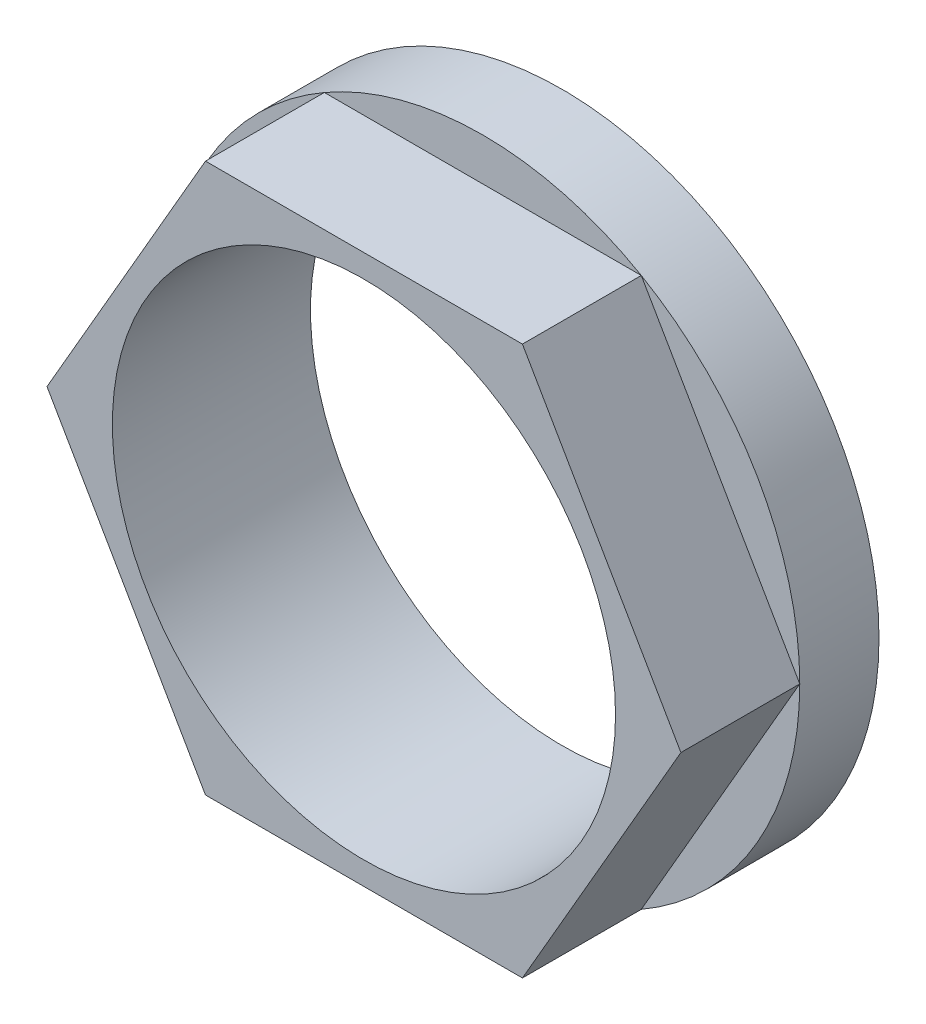
ISO-10303-21;
HEADER;
FILE_DESCRIPTION(('STEP AP214'),'2;1');
FILE_NAME('part.step','',(''),(''),'','','');
FILE_SCHEMA(('AUTOMOTIVE_DESIGN { 1 0 10303 214 1 1 1 1 }'));
ENDSEC;
DATA;
#1=APPLICATION_CONTEXT('core data for automotive mechanical design processes');
#2=APPLICATION_PROTOCOL_DEFINITION('international standard','automotive_design',2000,#1);
#3=PRODUCT_CONTEXT('',#1,'mechanical');
#4=PRODUCT('Part','Part','',(#3));
#5=PRODUCT_RELATED_PRODUCT_CATEGORY('part','',(#4));
#6=PRODUCT_DEFINITION_FORMATION('','',#4);
#7=PRODUCT_DEFINITION_CONTEXT('part definition',#1,'design');
#8=PRODUCT_DEFINITION('design','',#6,#7);
#9=PRODUCT_DEFINITION_SHAPE('','',#8);
#10=(LENGTH_UNIT() NAMED_UNIT(*) SI_UNIT(.MILLI.,.METRE.));
#11=(NAMED_UNIT(*) PLANE_ANGLE_UNIT() SI_UNIT($,.RADIAN.));
#12=(NAMED_UNIT(*) SI_UNIT($,.STERADIAN.) SOLID_ANGLE_UNIT());
#13=UNCERTAINTY_MEASURE_WITH_UNIT(LENGTH_MEASURE(1.E-05),#10,'distance_accuracy_value','');
#14=(GEOMETRIC_REPRESENTATION_CONTEXT(3) GLOBAL_UNCERTAINTY_ASSIGNED_CONTEXT((#13)) GLOBAL_UNIT_ASSIGNED_CONTEXT((#10,
#11,#12)) REPRESENTATION_CONTEXT('',''));
#15=CARTESIAN_POINT('',(0.,0.,0.));
#16=DIRECTION('',(0.,0.,1.));
#17=DIRECTION('',(1.,0.,0.));
#18=AXIS2_PLACEMENT_3D('',#15,#16,#17);
#19=CARTESIAN_POINT('',(0.,0.,2.));
#20=DIRECTION('',(0.,0.,1.));
#21=DIRECTION('',(1.,0.,0.));
#22=AXIS2_PLACEMENT_3D('',#19,#20,#21);
#23=PLANE('',#22);
#24=DIRECTION('',(0.499999999999995,0.866025403784442,0.));
#25=VECTOR('',#24,1.);
#26=CARTESIAN_POINT('',(4.00000000000008,-6.92820323027546,2.));
#27=LINE('',#26,#25);
#28=CARTESIAN_POINT('',(4.00000000000008,-6.92820323027546,2.));
#29=VERTEX_POINT('',#28);
#30=CARTESIAN_POINT('',(8.,0.,2.));
#31=VERTEX_POINT('',#30);
#32=EDGE_CURVE('E58',#29,#31,#27,.T.);
#33=ORIENTED_EDGE('',*,*,#32,.F.);
#34=CARTESIAN_POINT('',(0.,0.,2.));
#35=DIRECTION('',(0.,0.,1.));
#36=DIRECTION('',(1.,0.,0.));
#37=AXIS2_PLACEMENT_3D('',#34,#35,#36);
#38=CIRCLE('',#37,8.);
#39=EDGE_CURVE('E52',#29,#31,#38,.T.);
#40=ORIENTED_EDGE('',*,*,#39,.T.);
#41=EDGE_LOOP('',(#33,#40));
#42=FACE_BOUND('',#41,.T.);
#43=ADVANCED_FACE('F41',(#42),#23,.T.);
#44=DIRECTION('',(1.,0.,0.));
#45=VECTOR('',#44,1.);
#46=CARTESIAN_POINT('',(-3.99999999999994,-6.92820323027555,2.));
#47=LINE('',#46,#45);
#48=CARTESIAN_POINT('',(-3.99999999999994,-6.92820323027555,2.));
#49=VERTEX_POINT('',#48);
#50=EDGE_CURVE('E65',#49,#29,#47,.T.);
#51=ORIENTED_EDGE('',*,*,#50,.F.);
#52=EDGE_CURVE('E215',#49,#29,#38,.T.);
#53=ORIENTED_EDGE('',*,*,#52,.T.);
#54=EDGE_LOOP('',(#51,#53));
#55=FACE_BOUND('',#54,.T.);
#56=ADVANCED_FACE('F193',(#55),#23,.T.);
#57=DIRECTION('',(0.500000000000007,-0.866025403784435,0.));
#58=VECTOR('',#57,1.);
#59=CARTESIAN_POINT('',(-8.,0.,2.));
#60=LINE('',#59,#58);
#61=CARTESIAN_POINT('',(-8.,0.,2.));
#62=VERTEX_POINT('',#61);
#63=EDGE_CURVE('E149',#62,#49,#60,.T.);
#64=ORIENTED_EDGE('',*,*,#63,.F.);
#65=EDGE_CURVE('E345',#62,#49,#38,.T.);
#66=ORIENTED_EDGE('',*,*,#65,.T.);
#67=EDGE_LOOP('',(#64,#66));
#68=FACE_BOUND('',#67,.T.);
#69=ADVANCED_FACE('F199',(#68),#23,.T.);
#70=DIRECTION('',(-0.499999999999995,-0.866025403784442,0.));
#71=VECTOR('',#70,1.);
#72=CARTESIAN_POINT('',(-4.00000000000003,6.92820323027549,2.));
#73=LINE('',#72,#71);
#74=CARTESIAN_POINT('',(-4.00000000000003,6.92820323027549,2.));
#75=VERTEX_POINT('',#74);
#76=EDGE_CURVE('E153',#75,#62,#73,.T.);
#77=ORIENTED_EDGE('',*,*,#76,.F.);
#78=EDGE_CURVE('E222',#75,#62,#38,.T.);
#79=ORIENTED_EDGE('',*,*,#78,.T.);
#80=EDGE_LOOP('',(#77,#79));
#81=FACE_BOUND('',#80,.T.);
#82=ADVANCED_FACE('F209',(#81),#23,.T.);
#83=DIRECTION('',(-1.,0.,0.));
#84=VECTOR('',#83,1.);
#85=CARTESIAN_POINT('',(3.99999999999998,6.92820323027552,2.));
#86=LINE('',#85,#84);
#87=CARTESIAN_POINT('',(3.99999999999998,6.92820323027552,2.));
#88=VERTEX_POINT('',#87);
#89=EDGE_CURVE('E157',#88,#75,#86,.T.);
#90=ORIENTED_EDGE('',*,*,#89,.F.);
#91=EDGE_CURVE('E51',#88,#75,#38,.T.);
#92=ORIENTED_EDGE('',*,*,#91,.T.);
#93=EDGE_LOOP('',(#90,#92));
#94=FACE_BOUND('',#93,.T.);
#95=ADVANCED_FACE('F202',(#94),#23,.T.);
#96=DIRECTION('',(-0.500000000000001,0.866025403784438,0.));
#97=VECTOR('',#96,1.);
#98=CARTESIAN_POINT('',(8.,0.,2.));
#99=LINE('',#98,#97);
#100=EDGE_CURVE('E161',#31,#88,#99,.T.);
#101=ORIENTED_EDGE('',*,*,#100,.F.);
#102=EDGE_CURVE('E11',#31,#88,#38,.T.);
#103=ORIENTED_EDGE('',*,*,#102,.T.);
#104=EDGE_LOOP('',(#101,#103));
#105=FACE_BOUND('',#104,.T.);
#106=ADVANCED_FACE('F195',(#105),#23,.T.);
#107=CARTESIAN_POINT('',(0.,0.,0.));
#108=DIRECTION('',(0.,0.,1.));
#109=DIRECTION('',(1.,0.,0.));
#110=AXIS2_PLACEMENT_3D('',#107,#108,#109);
#111=PLANE('',#110);
#112=CARTESIAN_POINT('',(0.,0.,0.));
#113=DIRECTION('',(0.,0.,1.));
#114=DIRECTION('',(1.,0.,0.));
#115=AXIS2_PLACEMENT_3D('',#112,#113,#114);
#116=CIRCLE('',#115,8.);
#117=CARTESIAN_POINT('',(8.,0.,0.));
#118=VERTEX_POINT('',#117);
#119=EDGE_CURVE('E45',#118,#118,#116,.T.);
#120=ORIENTED_EDGE('',*,*,#119,.F.);
#121=EDGE_LOOP('',(#120));
#122=FACE_BOUND('',#121,.T.);
#123=CARTESIAN_POINT('',(0.,0.,0.));
#124=DIRECTION('',(0.,0.,1.));
#125=DIRECTION('',(1.,0.,0.));
#126=AXIS2_PLACEMENT_3D('',#123,#124,#125);
#127=CIRCLE('',#126,6.35);
#128=CARTESIAN_POINT('',(6.35,0.,0.));
#129=VERTEX_POINT('',#128);
#130=EDGE_CURVE('E124',#129,#129,#127,.T.);
#131=ORIENTED_EDGE('',*,*,#130,.T.);
#132=EDGE_LOOP('',(#131));
#133=FACE_BOUND('',#132,.T.);
#134=ADVANCED_FACE('F201',(#122,#133),#111,.F.);
#135=CARTESIAN_POINT('',(0.,0.,2.));
#136=DIRECTION('',(0.,0.,-1.));
#137=DIRECTION('',(-1.,0.,0.));
#138=AXIS2_PLACEMENT_3D('',#135,#136,#137);
#139=CYLINDRICAL_SURFACE('',#138,8.);
#140=ORIENTED_EDGE('',*,*,#102,.F.);
#141=ORIENTED_EDGE('',*,*,#39,.F.);
#142=ORIENTED_EDGE('',*,*,#52,.F.);
#143=ORIENTED_EDGE('',*,*,#65,.F.);
#144=ORIENTED_EDGE('',*,*,#78,.F.);
#145=ORIENTED_EDGE('',*,*,#91,.F.);
#146=EDGE_LOOP('',(#140,#141,#142,#143,#144,#145));
#147=FACE_BOUND('',#146,.T.);
#148=ORIENTED_EDGE('',*,*,#119,.T.);
#149=EDGE_LOOP('',(#148));
#150=FACE_BOUND('',#149,.T.);
#151=ADVANCED_FACE('F43',(#147,#150),#139,.T.);
#152=CARTESIAN_POINT('',(0.,0.,2.));
#153=DIRECTION('',(0.,0.,-1.));
#154=DIRECTION('',(-1.,0.,0.));
#155=AXIS2_PLACEMENT_3D('',#152,#153,#154);
#156=CYLINDRICAL_SURFACE('',#155,6.35);
#157=ORIENTED_EDGE('',*,*,#130,.F.);
#158=EDGE_LOOP('',(#157));
#159=FACE_BOUND('',#158,.T.);
#160=CARTESIAN_POINT('',(0.,0.,5.));
#161=DIRECTION('',(0.,0.,1.));
#162=DIRECTION('',(1.,0.,0.));
#163=AXIS2_PLACEMENT_3D('',#160,#161,#162);
#164=CIRCLE('',#163,6.35);
#165=CARTESIAN_POINT('',(6.35,0.,5.));
#166=VERTEX_POINT('',#165);
#167=EDGE_CURVE('E166',#166,#166,#164,.T.);
#168=ORIENTED_EDGE('',*,*,#167,.T.);
#169=EDGE_LOOP('',(#168));
#170=FACE_BOUND('',#169,.T.);
#171=ADVANCED_FACE('F181',(#159,#170),#156,.F.);
#172=CARTESIAN_POINT('',(0.,0.,5.));
#173=DIRECTION('',(0.,0.,1.));
#174=DIRECTION('',(1.,0.,0.));
#175=AXIS2_PLACEMENT_3D('',#172,#173,#174);
#176=PLANE('',#175);
#177=DIRECTION('',(0.499999999999995,0.866025403784442,0.));
#178=VECTOR('',#177,1.);
#179=CARTESIAN_POINT('',(4.00000000000008,-6.92820323027546,5.));
#180=LINE('',#179,#178);
#181=CARTESIAN_POINT('',(4.00000000000008,-6.92820323027546,5.));
#182=VERTEX_POINT('',#181);
#183=CARTESIAN_POINT('',(8.,0.,5.));
#184=VERTEX_POINT('',#183);
#185=EDGE_CURVE('E110',#182,#184,#180,.T.);
#186=ORIENTED_EDGE('',*,*,#185,.T.);
#187=DIRECTION('',(-0.500000000000001,0.866025403784438,0.));
#188=VECTOR('',#187,1.);
#189=CARTESIAN_POINT('',(8.,0.,5.));
#190=LINE('',#189,#188);
#191=CARTESIAN_POINT('',(3.99999999999998,6.92820323027552,5.));
#192=VERTEX_POINT('',#191);
#193=EDGE_CURVE('E98',#184,#192,#190,.T.);
#194=ORIENTED_EDGE('',*,*,#193,.T.);
#195=DIRECTION('',(-1.,0.,0.));
#196=VECTOR('',#195,1.);
#197=CARTESIAN_POINT('',(3.99999999999998,6.92820323027552,5.));
#198=LINE('',#197,#196);
#199=CARTESIAN_POINT('',(-4.00000000000003,6.92820323027549,5.));
#200=VERTEX_POINT('',#199);
#201=EDGE_CURVE('E109',#192,#200,#198,.T.);
#202=ORIENTED_EDGE('',*,*,#201,.T.);
#203=DIRECTION('',(-0.499999999999995,-0.866025403784442,0.));
#204=VECTOR('',#203,1.);
#205=CARTESIAN_POINT('',(-4.00000000000003,6.92820323027549,5.));
#206=LINE('',#205,#204);
#207=CARTESIAN_POINT('',(-8.,0.,5.));
#208=VERTEX_POINT('',#207);
#209=EDGE_CURVE('E172',#200,#208,#206,.T.);
#210=ORIENTED_EDGE('',*,*,#209,.T.);
#211=DIRECTION('',(0.500000000000007,-0.866025403784435,0.));
#212=VECTOR('',#211,1.);
#213=CARTESIAN_POINT('',(-8.,0.,5.));
#214=LINE('',#213,#212);
#215=CARTESIAN_POINT('',(-3.99999999999994,-6.92820323027555,5.));
#216=VERTEX_POINT('',#215);
#217=EDGE_CURVE('E169',#208,#216,#214,.T.);
#218=ORIENTED_EDGE('',*,*,#217,.T.);
#219=DIRECTION('',(1.,0.,0.));
#220=VECTOR('',#219,1.);
#221=CARTESIAN_POINT('',(-3.99999999999994,-6.92820323027555,5.));
#222=LINE('',#221,#220);
#223=EDGE_CURVE('E116',#216,#182,#222,.T.);
#224=ORIENTED_EDGE('',*,*,#223,.T.);
#225=EDGE_LOOP('',(#186,#194,#202,#210,#218,#224));
#226=FACE_BOUND('',#225,.T.);
#227=ORIENTED_EDGE('',*,*,#167,.F.);
#228=EDGE_LOOP('',(#227));
#229=FACE_BOUND('',#228,.T.);
#230=ADVANCED_FACE('F113',(#226,#229),#176,.T.);
#231=CARTESIAN_POINT('',(4.00000000000008,-6.92820323027546,5.));
#232=DIRECTION('',(-0.866025403784441,0.499999999999995,0.));
#233=DIRECTION('',(-0.499999999999995,-0.866025403784442,0.));
#234=AXIS2_PLACEMENT_3D('',#231,#232,#233);
#235=PLANE('',#234);
#236=ORIENTED_EDGE('',*,*,#32,.T.);
#237=DIRECTION('',(0.,0.,-1.));
#238=VECTOR('',#237,1.);
#239=CARTESIAN_POINT('',(8.,0.,5.));
#240=LINE('',#239,#238);
#241=EDGE_CURVE('E103',#184,#31,#240,.T.);
#242=ORIENTED_EDGE('',*,*,#241,.F.);
#243=ORIENTED_EDGE('',*,*,#185,.F.);
#244=DIRECTION('',(0.,0.,-1.));
#245=VECTOR('',#244,1.);
#246=CARTESIAN_POINT('',(4.00000000000008,-6.92820323027546,5.));
#247=LINE('',#246,#245);
#248=EDGE_CURVE('E144',#182,#29,#247,.T.);
#249=ORIENTED_EDGE('',*,*,#248,.T.);
#250=EDGE_LOOP('',(#236,#242,#243,#249));
#251=FACE_BOUND('',#250,.T.);
#252=ADVANCED_FACE('F122',(#251),#235,.F.);
#253=CARTESIAN_POINT('',(8.,0.,5.));
#254=DIRECTION('',(-0.866025403784438,-0.500000000000001,0.));
#255=DIRECTION('',(0.500000000000001,-0.866025403784438,0.));
#256=AXIS2_PLACEMENT_3D('',#253,#254,#255);
#257=PLANE('',#256);
#258=ORIENTED_EDGE('',*,*,#100,.T.);
#259=DIRECTION('',(0.,0.,-1.));
#260=VECTOR('',#259,1.);
#261=CARTESIAN_POINT('',(3.99999999999998,6.92820323027552,5.));
#262=LINE('',#261,#260);
#263=EDGE_CURVE('E105',#192,#88,#262,.T.);
#264=ORIENTED_EDGE('',*,*,#263,.F.);
#265=ORIENTED_EDGE('',*,*,#193,.F.);
#266=ORIENTED_EDGE('',*,*,#241,.T.);
#267=EDGE_LOOP('',(#258,#264,#265,#266));
#268=FACE_BOUND('',#267,.T.);
#269=ADVANCED_FACE('F101',(#268),#257,.F.);
#270=CARTESIAN_POINT('',(3.99999999999998,6.92820323027552,5.));
#271=DIRECTION('',(0.,-1.,0.));
#272=DIRECTION('',(1.,0.,0.));
#273=AXIS2_PLACEMENT_3D('',#270,#271,#272);
#274=PLANE('',#273);
#275=ORIENTED_EDGE('',*,*,#89,.T.);
#276=DIRECTION('',(0.,0.,-1.));
#277=VECTOR('',#276,1.);
#278=CARTESIAN_POINT('',(-4.00000000000003,6.92820323027549,5.));
#279=LINE('',#278,#277);
#280=EDGE_CURVE('E130',#200,#75,#279,.T.);
#281=ORIENTED_EDGE('',*,*,#280,.F.);
#282=ORIENTED_EDGE('',*,*,#201,.F.);
#283=ORIENTED_EDGE('',*,*,#263,.T.);
#284=EDGE_LOOP('',(#275,#281,#282,#283));
#285=FACE_BOUND('',#284,.T.);
#286=ADVANCED_FACE('F226',(#285),#274,.F.);
#287=CARTESIAN_POINT('',(-4.00000000000003,6.92820323027549,5.));
#288=DIRECTION('',(0.866025403784441,-0.499999999999995,0.));
#289=DIRECTION('',(0.499999999999995,0.866025403784442,0.));
#290=AXIS2_PLACEMENT_3D('',#287,#288,#289);
#291=PLANE('',#290);
#292=ORIENTED_EDGE('',*,*,#76,.T.);
#293=DIRECTION('',(0.,0.,-1.));
#294=VECTOR('',#293,1.);
#295=CARTESIAN_POINT('',(-8.,0.,5.));
#296=LINE('',#295,#294);
#297=EDGE_CURVE('E136',#208,#62,#296,.T.);
#298=ORIENTED_EDGE('',*,*,#297,.F.);
#299=ORIENTED_EDGE('',*,*,#209,.F.);
#300=ORIENTED_EDGE('',*,*,#280,.T.);
#301=EDGE_LOOP('',(#292,#298,#299,#300));
#302=FACE_BOUND('',#301,.T.);
#303=ADVANCED_FACE('F229',(#302),#291,.F.);
#304=CARTESIAN_POINT('',(-8.,0.,5.));
#305=DIRECTION('',(0.866025403784435,0.500000000000007,0.));
#306=DIRECTION('',(-0.500000000000007,0.866025403784435,0.));
#307=AXIS2_PLACEMENT_3D('',#304,#305,#306);
#308=PLANE('',#307);
#309=ORIENTED_EDGE('',*,*,#63,.T.);
#310=DIRECTION('',(0.,0.,-1.));
#311=VECTOR('',#310,1.);
#312=CARTESIAN_POINT('',(-3.99999999999994,-6.92820323027555,5.));
#313=LINE('',#312,#311);
#314=EDGE_CURVE('E140',#216,#49,#313,.T.);
#315=ORIENTED_EDGE('',*,*,#314,.F.);
#316=ORIENTED_EDGE('',*,*,#217,.F.);
#317=ORIENTED_EDGE('',*,*,#297,.T.);
#318=EDGE_LOOP('',(#309,#315,#316,#317));
#319=FACE_BOUND('',#318,.T.);
#320=ADVANCED_FACE('F234',(#319),#308,.F.);
#321=CARTESIAN_POINT('',(-3.99999999999994,-6.92820323027555,5.));
#322=DIRECTION('',(0.,1.,0.));
#323=DIRECTION('',(-1.,0.,0.));
#324=AXIS2_PLACEMENT_3D('',#321,#322,#323);
#325=PLANE('',#324);
#326=ORIENTED_EDGE('',*,*,#50,.T.);
#327=ORIENTED_EDGE('',*,*,#248,.F.);
#328=ORIENTED_EDGE('',*,*,#223,.F.);
#329=ORIENTED_EDGE('',*,*,#314,.T.);
#330=EDGE_LOOP('',(#326,#327,#328,#329));
#331=FACE_BOUND('',#330,.T.);
#332=ADVANCED_FACE('F236',(#331),#325,.F.);
#333=CLOSED_SHELL('',(#43,#56,#69,#82,#95,#106,#134,#151,#171,#230,#252,#269,#286,#303,#320,#332));
#334=MANIFOLD_SOLID_BREP('B2',#333);
#335=ADVANCED_BREP_SHAPE_REPRESENTATION('',(#18,#334),#14);
#336=SHAPE_DEFINITION_REPRESENTATION(#9,#335);
ENDSEC;
END-ISO-10303-21;
